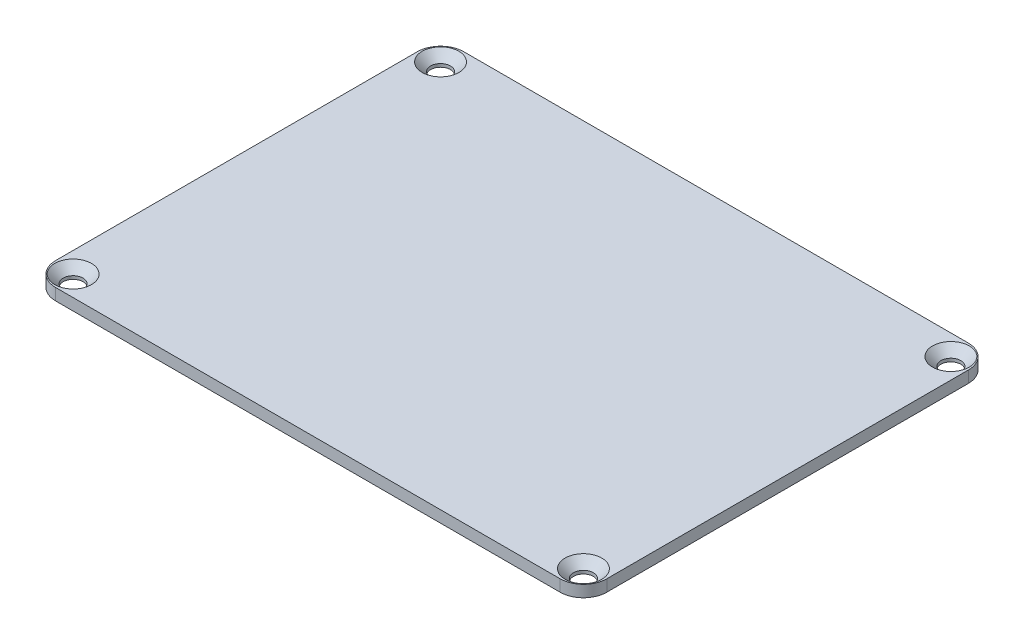
ISO-10303-21;
HEADER;
FILE_DESCRIPTION(('STEP AP214'),'2;1');
FILE_NAME('part.step','',(''),(''),'','','');
FILE_SCHEMA(('AUTOMOTIVE_DESIGN { 1 0 10303 214 1 1 1 1 }'));
ENDSEC;
DATA;
#1=APPLICATION_CONTEXT('core data for automotive mechanical design processes');
#2=APPLICATION_PROTOCOL_DEFINITION('international standard','automotive_design',2000,#1);
#3=PRODUCT_CONTEXT('',#1,'mechanical');
#4=PRODUCT('Part','Part','',(#3));
#5=PRODUCT_RELATED_PRODUCT_CATEGORY('part','',(#4));
#6=PRODUCT_DEFINITION_FORMATION('','',#4);
#7=PRODUCT_DEFINITION_CONTEXT('part definition',#1,'design');
#8=PRODUCT_DEFINITION('design','',#6,#7);
#9=PRODUCT_DEFINITION_SHAPE('','',#8);
#10=(LENGTH_UNIT() NAMED_UNIT(*) SI_UNIT(.MILLI.,.METRE.));
#11=(NAMED_UNIT(*) PLANE_ANGLE_UNIT() SI_UNIT($,.RADIAN.));
#12=(NAMED_UNIT(*) SI_UNIT($,.STERADIAN.) SOLID_ANGLE_UNIT());
#13=UNCERTAINTY_MEASURE_WITH_UNIT(LENGTH_MEASURE(1.E-05),#10,'distance_accuracy_value','');
#14=(GEOMETRIC_REPRESENTATION_CONTEXT(3) GLOBAL_UNCERTAINTY_ASSIGNED_CONTEXT((#13)) GLOBAL_UNIT_ASSIGNED_CONTEXT((#10,
#11,#12)) REPRESENTATION_CONTEXT('',''));
#15=CARTESIAN_POINT('',(0.,0.,0.));
#16=DIRECTION('',(0.,0.,1.));
#17=DIRECTION('',(1.,0.,0.));
#18=AXIS2_PLACEMENT_3D('',#15,#16,#17);
#19=CARTESIAN_POINT('',(47.25,-2.,-35.));
#20=DIRECTION('',(1.,0.,0.));
#21=DIRECTION('',(0.,0.,-1.));
#22=AXIS2_PLACEMENT_3D('',#19,#20,#21);
#23=PLANE('',#22);
#24=DIRECTION('',(0.,0.,-1.));
#25=VECTOR('',#24,1.);
#26=CARTESIAN_POINT('',(47.25,-2.,-35.));
#27=LINE('',#26,#25);
#28=CARTESIAN_POINT('',(47.25,-2.,31.));
#29=VERTEX_POINT('',#28);
#30=CARTESIAN_POINT('',(47.25,-2.,-31.));
#31=VERTEX_POINT('',#30);
#32=EDGE_CURVE('E179',#29,#31,#27,.T.);
#33=ORIENTED_EDGE('',*,*,#32,.T.);
#34=DIRECTION('',(0.,1.,0.));
#35=VECTOR('',#34,1.);
#36=CARTESIAN_POINT('',(47.25,-2.,-31.));
#37=LINE('',#36,#35);
#38=CARTESIAN_POINT('',(47.25,0.,-31.));
#39=VERTEX_POINT('',#38);
#40=EDGE_CURVE('E173',#31,#39,#37,.T.);
#41=ORIENTED_EDGE('',*,*,#40,.T.);
#42=DIRECTION('',(0.,0.,-1.));
#43=VECTOR('',#42,1.);
#44=CARTESIAN_POINT('',(47.25,0.,-35.));
#45=LINE('',#44,#43);
#46=CARTESIAN_POINT('',(47.25,0.,31.));
#47=VERTEX_POINT('',#46);
#48=EDGE_CURVE('E111',#47,#39,#45,.T.);
#49=ORIENTED_EDGE('',*,*,#48,.F.);
#50=DIRECTION('',(0.,1.,0.));
#51=VECTOR('',#50,1.);
#52=CARTESIAN_POINT('',(47.25,-2.,31.));
#53=LINE('',#52,#51);
#54=EDGE_CURVE('E170',#47,#29,#53,.F.);
#55=ORIENTED_EDGE('',*,*,#54,.T.);
#56=EDGE_LOOP('',(#33,#41,#49,#55));
#57=FACE_BOUND('',#56,.T.);
#58=ADVANCED_FACE('F39',(#57),#23,.T.);
#59=CARTESIAN_POINT('',(-47.25,-2.,35.));
#60=DIRECTION('',(0.,0.,1.));
#61=DIRECTION('',(1.,0.,0.));
#62=AXIS2_PLACEMENT_3D('',#59,#60,#61);
#63=PLANE('',#62);
#64=DIRECTION('',(1.,0.,0.));
#65=VECTOR('',#64,1.);
#66=CARTESIAN_POINT('',(-47.25,-2.,35.));
#67=LINE('',#66,#65);
#68=CARTESIAN_POINT('',(-43.25,-2.,35.));
#69=VERTEX_POINT('',#68);
#70=CARTESIAN_POINT('',(43.25,-2.,35.));
#71=VERTEX_POINT('',#70);
#72=EDGE_CURVE('E135',#69,#71,#67,.T.);
#73=ORIENTED_EDGE('',*,*,#72,.T.);
#74=DIRECTION('',(0.,1.,0.));
#75=VECTOR('',#74,1.);
#76=CARTESIAN_POINT('',(43.25,-2.,35.));
#77=LINE('',#76,#75);
#78=CARTESIAN_POINT('',(43.25,0.,35.));
#79=VERTEX_POINT('',#78);
#80=EDGE_CURVE('E11',#71,#79,#77,.T.);
#81=ORIENTED_EDGE('',*,*,#80,.T.);
#82=DIRECTION('',(1.,0.,0.));
#83=VECTOR('',#82,1.);
#84=CARTESIAN_POINT('',(-47.25,0.,35.));
#85=LINE('',#84,#83);
#86=CARTESIAN_POINT('',(-43.25,0.,35.));
#87=VERTEX_POINT('',#86);
#88=EDGE_CURVE('E182',#87,#79,#85,.T.);
#89=ORIENTED_EDGE('',*,*,#88,.F.);
#90=DIRECTION('',(0.,1.,0.));
#91=VECTOR('',#90,1.);
#92=CARTESIAN_POINT('',(-43.25,-2.,35.));
#93=LINE('',#92,#91);
#94=EDGE_CURVE('E48',#87,#69,#93,.F.);
#95=ORIENTED_EDGE('',*,*,#94,.T.);
#96=EDGE_LOOP('',(#73,#81,#89,#95));
#97=FACE_BOUND('',#96,.T.);
#98=ADVANCED_FACE('F257',(#97),#63,.T.);
#99=CARTESIAN_POINT('',(-47.25,-2.,-35.));
#100=DIRECTION('',(-1.,0.,0.));
#101=DIRECTION('',(0.,0.,1.));
#102=AXIS2_PLACEMENT_3D('',#99,#100,#101);
#103=PLANE('',#102);
#104=DIRECTION('',(0.,0.,1.));
#105=VECTOR('',#104,1.);
#106=CARTESIAN_POINT('',(-47.25,0.,-35.));
#107=LINE('',#106,#105);
#108=CARTESIAN_POINT('',(-47.25,0.,-31.));
#109=VERTEX_POINT('',#108);
#110=CARTESIAN_POINT('',(-47.25,0.,31.));
#111=VERTEX_POINT('',#110);
#112=EDGE_CURVE('E129',#109,#111,#107,.T.);
#113=ORIENTED_EDGE('',*,*,#112,.F.);
#114=DIRECTION('',(0.,1.,0.));
#115=VECTOR('',#114,1.);
#116=CARTESIAN_POINT('',(-47.25,-2.,-31.));
#117=LINE('',#116,#115);
#118=CARTESIAN_POINT('',(-47.25,-2.,-31.));
#119=VERTEX_POINT('',#118);
#120=EDGE_CURVE('E157',#109,#119,#117,.F.);
#121=ORIENTED_EDGE('',*,*,#120,.T.);
#122=DIRECTION('',(0.,0.,1.));
#123=VECTOR('',#122,1.);
#124=CARTESIAN_POINT('',(-47.25,-2.,-35.));
#125=LINE('',#124,#123);
#126=CARTESIAN_POINT('',(-47.25,-2.,31.));
#127=VERTEX_POINT('',#126);
#128=EDGE_CURVE('E141',#119,#127,#125,.T.);
#129=ORIENTED_EDGE('',*,*,#128,.T.);
#130=DIRECTION('',(0.,1.,0.));
#131=VECTOR('',#130,1.);
#132=CARTESIAN_POINT('',(-47.25,-2.,31.));
#133=LINE('',#132,#131);
#134=EDGE_CURVE('E153',#127,#111,#133,.T.);
#135=ORIENTED_EDGE('',*,*,#134,.T.);
#136=EDGE_LOOP('',(#113,#121,#129,#135));
#137=FACE_BOUND('',#136,.T.);
#138=ADVANCED_FACE('F262',(#137),#103,.T.);
#139=CARTESIAN_POINT('',(-47.25,-2.,-35.));
#140=DIRECTION('',(0.,0.,-1.));
#141=DIRECTION('',(-1.,0.,0.));
#142=AXIS2_PLACEMENT_3D('',#139,#140,#141);
#143=PLANE('',#142);
#144=DIRECTION('',(-1.,0.,0.));
#145=VECTOR('',#144,1.);
#146=CARTESIAN_POINT('',(-47.25,-2.,-35.));
#147=LINE('',#146,#145);
#148=CARTESIAN_POINT('',(43.25,-2.,-35.));
#149=VERTEX_POINT('',#148);
#150=CARTESIAN_POINT('',(-43.25,-2.,-35.));
#151=VERTEX_POINT('',#150);
#152=EDGE_CURVE('E181',#149,#151,#147,.T.);
#153=ORIENTED_EDGE('',*,*,#152,.T.);
#154=DIRECTION('',(0.,1.,0.));
#155=VECTOR('',#154,1.);
#156=CARTESIAN_POINT('',(-43.25,-2.,-35.));
#157=LINE('',#156,#155);
#158=CARTESIAN_POINT('',(-43.25,0.,-35.));
#159=VERTEX_POINT('',#158);
#160=EDGE_CURVE('E127',#151,#159,#157,.T.);
#161=ORIENTED_EDGE('',*,*,#160,.T.);
#162=DIRECTION('',(-1.,0.,0.));
#163=VECTOR('',#162,1.);
#164=CARTESIAN_POINT('',(-47.25,0.,-35.));
#165=LINE('',#164,#163);
#166=CARTESIAN_POINT('',(43.25,0.,-35.));
#167=VERTEX_POINT('',#166);
#168=EDGE_CURVE('E109',#167,#159,#165,.T.);
#169=ORIENTED_EDGE('',*,*,#168,.F.);
#170=DIRECTION('',(0.,1.,0.));
#171=VECTOR('',#170,1.);
#172=CARTESIAN_POINT('',(43.25,-2.,-35.));
#173=LINE('',#172,#171);
#174=EDGE_CURVE('E124',#167,#149,#173,.F.);
#175=ORIENTED_EDGE('',*,*,#174,.T.);
#176=EDGE_LOOP('',(#153,#161,#169,#175));
#177=FACE_BOUND('',#176,.T.);
#178=ADVANCED_FACE('F123',(#177),#143,.T.);
#179=CARTESIAN_POINT('',(0.,-2.,0.));
#180=DIRECTION('',(0.,1.,0.));
#181=DIRECTION('',(0.,0.,1.));
#182=AXIS2_PLACEMENT_3D('',#179,#180,#181);
#183=PLANE('',#182);
#184=CARTESIAN_POINT('',(-43.75,-2.,-31.5));
#185=DIRECTION('',(0.,1.,0.));
#186=DIRECTION('',(0.,0.,1.));
#187=AXIS2_PLACEMENT_3D('',#184,#185,#186);
#188=CIRCLE('',#187,1.69999999999999);
#189=CARTESIAN_POINT('',(-43.75,-2.,-29.8));
#190=VERTEX_POINT('',#189);
#191=EDGE_CURVE('E144',#190,#190,#188,.T.);
#192=ORIENTED_EDGE('',*,*,#191,.T.);
#193=EDGE_LOOP('',(#192));
#194=FACE_BOUND('',#193,.T.);
#195=CARTESIAN_POINT('',(43.75,-2.,-31.5));
#196=DIRECTION('',(0.,1.,0.));
#197=DIRECTION('',(0.,0.,1.));
#198=AXIS2_PLACEMENT_3D('',#195,#196,#197);
#199=CIRCLE('',#198,1.69999999999999);
#200=CARTESIAN_POINT('',(43.75,-2.,-29.8));
#201=VERTEX_POINT('',#200);
#202=EDGE_CURVE('E210',#201,#201,#199,.T.);
#203=ORIENTED_EDGE('',*,*,#202,.T.);
#204=EDGE_LOOP('',(#203));
#205=FACE_BOUND('',#204,.T.);
#206=CARTESIAN_POINT('',(43.75,-2.,31.5));
#207=DIRECTION('',(0.,1.,0.));
#208=DIRECTION('',(0.,0.,1.));
#209=AXIS2_PLACEMENT_3D('',#206,#207,#208);
#210=CIRCLE('',#209,1.69999999999999);
#211=CARTESIAN_POINT('',(43.75,-2.,33.2));
#212=VERTEX_POINT('',#211);
#213=EDGE_CURVE('E205',#212,#212,#210,.T.);
#214=ORIENTED_EDGE('',*,*,#213,.T.);
#215=EDGE_LOOP('',(#214));
#216=FACE_BOUND('',#215,.T.);
#217=CARTESIAN_POINT('',(-43.75,-2.,31.5));
#218=DIRECTION('',(0.,1.,0.));
#219=DIRECTION('',(0.,0.,1.));
#220=AXIS2_PLACEMENT_3D('',#217,#218,#219);
#221=CIRCLE('',#220,1.69999999999999);
#222=CARTESIAN_POINT('',(-43.75,-2.,33.2));
#223=VERTEX_POINT('',#222);
#224=EDGE_CURVE('E197',#223,#223,#221,.T.);
#225=ORIENTED_EDGE('',*,*,#224,.T.);
#226=EDGE_LOOP('',(#225));
#227=FACE_BOUND('',#226,.T.);
#228=ORIENTED_EDGE('',*,*,#128,.F.);
#229=CARTESIAN_POINT('',(-43.25,-2.,-31.));
#230=DIRECTION('',(0.,1.,0.));
#231=DIRECTION('',(0.,0.,1.));
#232=AXIS2_PLACEMENT_3D('',#229,#230,#231);
#233=CIRCLE('',#232,4.);
#234=EDGE_CURVE('E167',#119,#151,#233,.F.);
#235=ORIENTED_EDGE('',*,*,#234,.T.);
#236=ORIENTED_EDGE('',*,*,#152,.F.);
#237=CARTESIAN_POINT('',(43.25,-2.,-31.));
#238=DIRECTION('',(0.,1.,0.));
#239=DIRECTION('',(0.,0.,1.));
#240=AXIS2_PLACEMENT_3D('',#237,#238,#239);
#241=CIRCLE('',#240,4.);
#242=EDGE_CURVE('E133',#149,#31,#241,.F.);
#243=ORIENTED_EDGE('',*,*,#242,.T.);
#244=ORIENTED_EDGE('',*,*,#32,.F.);
#245=CARTESIAN_POINT('',(43.25,-2.,31.));
#246=DIRECTION('',(0.,1.,0.));
#247=DIRECTION('',(0.,0.,1.));
#248=AXIS2_PLACEMENT_3D('',#245,#246,#247);
#249=CIRCLE('',#248,4.);
#250=EDGE_CURVE('E55',#29,#71,#249,.F.);
#251=ORIENTED_EDGE('',*,*,#250,.T.);
#252=ORIENTED_EDGE('',*,*,#72,.F.);
#253=CARTESIAN_POINT('',(-43.25,-2.,31.));
#254=DIRECTION('',(0.,1.,0.));
#255=DIRECTION('',(0.,0.,1.));
#256=AXIS2_PLACEMENT_3D('',#253,#254,#255);
#257=CIRCLE('',#256,4.);
#258=EDGE_CURVE('E160',#69,#127,#257,.F.);
#259=ORIENTED_EDGE('',*,*,#258,.T.);
#260=EDGE_LOOP('',(#228,#235,#236,#243,#244,#251,#252,#259));
#261=FACE_BOUND('',#260,.T.);
#262=ADVANCED_FACE('F288',(#194,#205,#216,#227,#261),#183,.F.);
#263=CARTESIAN_POINT('',(0.,0.,0.));
#264=DIRECTION('',(0.,1.,0.));
#265=DIRECTION('',(0.,0.,1.));
#266=AXIS2_PLACEMENT_3D('',#263,#264,#265);
#267=PLANE('',#266);
#268=CARTESIAN_POINT('',(-43.75,0.,-31.5));
#269=DIRECTION('',(0.,1.,0.));
#270=DIRECTION('',(0.,0.,1.));
#271=AXIS2_PLACEMENT_3D('',#268,#269,#270);
#272=CIRCLE('',#271,3.15);
#273=CARTESIAN_POINT('',(-43.75,0.,-28.35));
#274=VERTEX_POINT('',#273);
#275=EDGE_CURVE('E428',#274,#274,#272,.T.);
#276=ORIENTED_EDGE('',*,*,#275,.F.);
#277=EDGE_LOOP('',(#276));
#278=FACE_BOUND('',#277,.T.);
#279=CARTESIAN_POINT('',(43.75,0.,-31.5));
#280=DIRECTION('',(0.,1.,0.));
#281=DIRECTION('',(0.,0.,1.));
#282=AXIS2_PLACEMENT_3D('',#279,#280,#281);
#283=CIRCLE('',#282,3.15);
#284=CARTESIAN_POINT('',(43.75,0.,-28.35));
#285=VERTEX_POINT('',#284);
#286=EDGE_CURVE('E222',#285,#285,#283,.T.);
#287=ORIENTED_EDGE('',*,*,#286,.F.);
#288=EDGE_LOOP('',(#287));
#289=FACE_BOUND('',#288,.T.);
#290=CARTESIAN_POINT('',(43.75,0.,31.5));
#291=DIRECTION('',(0.,1.,0.));
#292=DIRECTION('',(0.,0.,1.));
#293=AXIS2_PLACEMENT_3D('',#290,#291,#292);
#294=CIRCLE('',#293,3.15);
#295=CARTESIAN_POINT('',(43.75,0.,34.65));
#296=VERTEX_POINT('',#295);
#297=EDGE_CURVE('E213',#296,#296,#294,.T.);
#298=ORIENTED_EDGE('',*,*,#297,.F.);
#299=EDGE_LOOP('',(#298));
#300=FACE_BOUND('',#299,.T.);
#301=CARTESIAN_POINT('',(-43.75,0.,31.5));
#302=DIRECTION('',(0.,1.,0.));
#303=DIRECTION('',(0.,0.,1.));
#304=AXIS2_PLACEMENT_3D('',#301,#302,#303);
#305=CIRCLE('',#304,3.15);
#306=CARTESIAN_POINT('',(-43.75,0.,34.65));
#307=VERTEX_POINT('',#306);
#308=EDGE_CURVE('E208',#307,#307,#305,.T.);
#309=ORIENTED_EDGE('',*,*,#308,.F.);
#310=EDGE_LOOP('',(#309));
#311=FACE_BOUND('',#310,.T.);
#312=ORIENTED_EDGE('',*,*,#168,.T.);
#313=CARTESIAN_POINT('',(-43.25,0.,-31.));
#314=DIRECTION('',(0.,1.,0.));
#315=DIRECTION('',(0.,0.,1.));
#316=AXIS2_PLACEMENT_3D('',#313,#314,#315);
#317=CIRCLE('',#316,4.);
#318=EDGE_CURVE('E117',#159,#109,#317,.T.);
#319=ORIENTED_EDGE('',*,*,#318,.T.);
#320=ORIENTED_EDGE('',*,*,#112,.T.);
#321=CARTESIAN_POINT('',(-43.25,0.,31.));
#322=DIRECTION('',(0.,1.,0.));
#323=DIRECTION('',(0.,0.,1.));
#324=AXIS2_PLACEMENT_3D('',#321,#322,#323);
#325=CIRCLE('',#324,4.);
#326=EDGE_CURVE('E139',#111,#87,#325,.T.);
#327=ORIENTED_EDGE('',*,*,#326,.T.);
#328=ORIENTED_EDGE('',*,*,#88,.T.);
#329=CARTESIAN_POINT('',(43.25,0.,31.));
#330=DIRECTION('',(0.,1.,0.));
#331=DIRECTION('',(0.,0.,1.));
#332=AXIS2_PLACEMENT_3D('',#329,#330,#331);
#333=CIRCLE('',#332,4.);
#334=EDGE_CURVE('E118',#79,#47,#333,.T.);
#335=ORIENTED_EDGE('',*,*,#334,.T.);
#336=ORIENTED_EDGE('',*,*,#48,.T.);
#337=CARTESIAN_POINT('',(43.25,0.,-31.));
#338=DIRECTION('',(0.,1.,0.));
#339=DIRECTION('',(0.,0.,1.));
#340=AXIS2_PLACEMENT_3D('',#337,#338,#339);
#341=CIRCLE('',#340,4.);
#342=EDGE_CURVE('E106',#39,#167,#341,.T.);
#343=ORIENTED_EDGE('',*,*,#342,.T.);
#344=EDGE_LOOP('',(#312,#319,#320,#327,#328,#335,#336,#343));
#345=FACE_BOUND('',#344,.T.);
#346=ADVANCED_FACE('F108',(#278,#289,#300,#311,#345),#267,.T.);
#347=CARTESIAN_POINT('',(-43.75,0.,31.5));
#348=DIRECTION('',(0.,1.,0.));
#349=DIRECTION('',(0.,0.,1.));
#350=AXIS2_PLACEMENT_3D('',#347,#348,#349);
#351=CYLINDRICAL_SURFACE('',#350,1.69999999999999);
#352=CARTESIAN_POINT('',(-43.75,-1.45,31.5));
#353=DIRECTION('',(0.,1.,0.));
#354=DIRECTION('',(0.,0.,1.));
#355=AXIS2_PLACEMENT_3D('',#352,#353,#354);
#356=CIRCLE('',#355,1.69999999999999);
#357=CARTESIAN_POINT('',(-43.75,-1.45,33.2));
#358=VERTEX_POINT('',#357);
#359=EDGE_CURVE('E190',#358,#358,#356,.T.);
#360=ORIENTED_EDGE('',*,*,#359,.T.);
#361=EDGE_LOOP('',(#360));
#362=FACE_BOUND('',#361,.T.);
#363=ORIENTED_EDGE('',*,*,#224,.F.);
#364=EDGE_LOOP('',(#363));
#365=FACE_BOUND('',#364,.T.);
#366=ADVANCED_FACE('F241',(#362,#365),#351,.F.);
#367=CARTESIAN_POINT('',(-43.75,0.,31.5));
#368=DIRECTION('',(0.,1.,0.));
#369=DIRECTION('',(0.,0.,1.));
#370=AXIS2_PLACEMENT_3D('',#367,#368,#369);
#371=CONICAL_SURFACE('',#370,3.15,0.785398163397451);
#372=ORIENTED_EDGE('',*,*,#359,.F.);
#373=EDGE_LOOP('',(#372));
#374=FACE_BOUND('',#373,.T.);
#375=ORIENTED_EDGE('',*,*,#308,.T.);
#376=EDGE_LOOP('',(#375));
#377=FACE_BOUND('',#376,.T.);
#378=ADVANCED_FACE('F244',(#374,#377),#371,.F.);
#379=CARTESIAN_POINT('',(43.75,0.,31.5));
#380=DIRECTION('',(0.,1.,0.));
#381=DIRECTION('',(0.,0.,1.));
#382=AXIS2_PLACEMENT_3D('',#379,#380,#381);
#383=CYLINDRICAL_SURFACE('',#382,1.69999999999999);
#384=CARTESIAN_POINT('',(43.75,-1.45,31.5));
#385=DIRECTION('',(0.,1.,0.));
#386=DIRECTION('',(0.,0.,1.));
#387=AXIS2_PLACEMENT_3D('',#384,#385,#386);
#388=CIRCLE('',#387,1.69999999999999);
#389=CARTESIAN_POINT('',(43.75,-1.45,33.2));
#390=VERTEX_POINT('',#389);
#391=EDGE_CURVE('E209',#390,#390,#388,.T.);
#392=ORIENTED_EDGE('',*,*,#391,.T.);
#393=EDGE_LOOP('',(#392));
#394=FACE_BOUND('',#393,.T.);
#395=ORIENTED_EDGE('',*,*,#213,.F.);
#396=EDGE_LOOP('',(#395));
#397=FACE_BOUND('',#396,.T.);
#398=ADVANCED_FACE('F246',(#394,#397),#383,.F.);
#399=CARTESIAN_POINT('',(43.75,0.,31.5));
#400=DIRECTION('',(0.,1.,0.));
#401=DIRECTION('',(0.,0.,1.));
#402=AXIS2_PLACEMENT_3D('',#399,#400,#401);
#403=CONICAL_SURFACE('',#402,3.15,0.785398163397451);
#404=ORIENTED_EDGE('',*,*,#391,.F.);
#405=EDGE_LOOP('',(#404));
#406=FACE_BOUND('',#405,.T.);
#407=ORIENTED_EDGE('',*,*,#297,.T.);
#408=EDGE_LOOP('',(#407));
#409=FACE_BOUND('',#408,.T.);
#410=ADVANCED_FACE('F252',(#406,#409),#403,.F.);
#411=CARTESIAN_POINT('',(43.75,0.,-31.5));
#412=DIRECTION('',(0.,1.,0.));
#413=DIRECTION('',(0.,0.,1.));
#414=AXIS2_PLACEMENT_3D('',#411,#412,#413);
#415=CYLINDRICAL_SURFACE('',#414,1.69999999999999);
#416=CARTESIAN_POINT('',(43.75,-1.45,-31.5));
#417=DIRECTION('',(0.,1.,0.));
#418=DIRECTION('',(0.,0.,1.));
#419=AXIS2_PLACEMENT_3D('',#416,#417,#418);
#420=CIRCLE('',#419,1.69999999999999);
#421=CARTESIAN_POINT('',(43.75,-1.45,-29.8));
#422=VERTEX_POINT('',#421);
#423=EDGE_CURVE('E214',#422,#422,#420,.T.);
#424=ORIENTED_EDGE('',*,*,#423,.T.);
#425=EDGE_LOOP('',(#424));
#426=FACE_BOUND('',#425,.T.);
#427=ORIENTED_EDGE('',*,*,#202,.F.);
#428=EDGE_LOOP('',(#427));
#429=FACE_BOUND('',#428,.T.);
#430=ADVANCED_FACE('F365',(#426,#429),#415,.F.);
#431=CARTESIAN_POINT('',(43.75,0.,-31.5));
#432=DIRECTION('',(0.,1.,0.));
#433=DIRECTION('',(0.,0.,1.));
#434=AXIS2_PLACEMENT_3D('',#431,#432,#433);
#435=CONICAL_SURFACE('',#434,3.15,0.785398163397451);
#436=ORIENTED_EDGE('',*,*,#423,.F.);
#437=EDGE_LOOP('',(#436));
#438=FACE_BOUND('',#437,.T.);
#439=ORIENTED_EDGE('',*,*,#286,.T.);
#440=EDGE_LOOP('',(#439));
#441=FACE_BOUND('',#440,.T.);
#442=ADVANCED_FACE('F357',(#438,#441),#435,.F.);
#443=CARTESIAN_POINT('',(-43.75,0.,-31.5));
#444=DIRECTION('',(0.,1.,0.));
#445=DIRECTION('',(0.,0.,1.));
#446=AXIS2_PLACEMENT_3D('',#443,#444,#445);
#447=CYLINDRICAL_SURFACE('',#446,1.69999999999999);
#448=CARTESIAN_POINT('',(-43.75,-1.45,-31.5));
#449=DIRECTION('',(0.,1.,0.));
#450=DIRECTION('',(0.,0.,1.));
#451=AXIS2_PLACEMENT_3D('',#448,#449,#450);
#452=CIRCLE('',#451,1.69999999999999);
#453=CARTESIAN_POINT('',(-43.75,-1.45,-29.8));
#454=VERTEX_POINT('',#453);
#455=EDGE_CURVE('E424',#454,#454,#452,.T.);
#456=ORIENTED_EDGE('',*,*,#455,.T.);
#457=EDGE_LOOP('',(#456));
#458=FACE_BOUND('',#457,.T.);
#459=ORIENTED_EDGE('',*,*,#191,.F.);
#460=EDGE_LOOP('',(#459));
#461=FACE_BOUND('',#460,.T.);
#462=ADVANCED_FACE('F350',(#458,#461),#447,.F.);
#463=CARTESIAN_POINT('',(-43.75,0.,-31.5));
#464=DIRECTION('',(0.,1.,0.));
#465=DIRECTION('',(0.,0.,1.));
#466=AXIS2_PLACEMENT_3D('',#463,#464,#465);
#467=CONICAL_SURFACE('',#466,3.15,0.785398163397451);
#468=ORIENTED_EDGE('',*,*,#455,.F.);
#469=EDGE_LOOP('',(#468));
#470=FACE_BOUND('',#469,.T.);
#471=ORIENTED_EDGE('',*,*,#275,.T.);
#472=EDGE_LOOP('',(#471));
#473=FACE_BOUND('',#472,.T.);
#474=ADVANCED_FACE('F270',(#470,#473),#467,.F.);
#475=CARTESIAN_POINT('',(-43.25,-2.,-31.));
#476=DIRECTION('',(0.,1.,0.));
#477=DIRECTION('',(0.,0.,1.));
#478=AXIS2_PLACEMENT_3D('',#475,#476,#477);
#479=CYLINDRICAL_SURFACE('',#478,4.);
#480=ORIENTED_EDGE('',*,*,#234,.F.);
#481=ORIENTED_EDGE('',*,*,#120,.F.);
#482=ORIENTED_EDGE('',*,*,#318,.F.);
#483=ORIENTED_EDGE('',*,*,#160,.F.);
#484=EDGE_LOOP('',(#480,#481,#482,#483));
#485=FACE_BOUND('',#484,.T.);
#486=ADVANCED_FACE('F267',(#485),#479,.T.);
#487=CARTESIAN_POINT('',(43.25,-2.,-31.));
#488=DIRECTION('',(0.,1.,0.));
#489=DIRECTION('',(0.,0.,1.));
#490=AXIS2_PLACEMENT_3D('',#487,#488,#489);
#491=CYLINDRICAL_SURFACE('',#490,4.);
#492=ORIENTED_EDGE('',*,*,#242,.F.);
#493=ORIENTED_EDGE('',*,*,#174,.F.);
#494=ORIENTED_EDGE('',*,*,#342,.F.);
#495=ORIENTED_EDGE('',*,*,#40,.F.);
#496=EDGE_LOOP('',(#492,#493,#494,#495));
#497=FACE_BOUND('',#496,.T.);
#498=ADVANCED_FACE('F132',(#497),#491,.T.);
#499=CARTESIAN_POINT('',(43.25,-2.,31.));
#500=DIRECTION('',(0.,1.,0.));
#501=DIRECTION('',(0.,0.,1.));
#502=AXIS2_PLACEMENT_3D('',#499,#500,#501);
#503=CYLINDRICAL_SURFACE('',#502,4.);
#504=ORIENTED_EDGE('',*,*,#250,.F.);
#505=ORIENTED_EDGE('',*,*,#54,.F.);
#506=ORIENTED_EDGE('',*,*,#334,.F.);
#507=ORIENTED_EDGE('',*,*,#80,.F.);
#508=EDGE_LOOP('',(#504,#505,#506,#507));
#509=FACE_BOUND('',#508,.T.);
#510=ADVANCED_FACE('F273',(#509),#503,.T.);
#511=CARTESIAN_POINT('',(-43.25,-2.,31.));
#512=DIRECTION('',(0.,1.,0.));
#513=DIRECTION('',(0.,0.,1.));
#514=AXIS2_PLACEMENT_3D('',#511,#512,#513);
#515=CYLINDRICAL_SURFACE('',#514,4.);
#516=ORIENTED_EDGE('',*,*,#258,.F.);
#517=ORIENTED_EDGE('',*,*,#94,.F.);
#518=ORIENTED_EDGE('',*,*,#326,.F.);
#519=ORIENTED_EDGE('',*,*,#134,.F.);
#520=EDGE_LOOP('',(#516,#517,#518,#519));
#521=FACE_BOUND('',#520,.T.);
#522=ADVANCED_FACE('F41',(#521),#515,.T.);
#523=CLOSED_SHELL('',(#58,#98,#138,#178,#262,#346,#366,#378,#398,#410,#430,#442,#462,#474,#486,
#498,#510,#522));
#524=MANIFOLD_SOLID_BREP('B2',#523);
#525=ADVANCED_BREP_SHAPE_REPRESENTATION('',(#18,#524),#14);
#526=SHAPE_DEFINITION_REPRESENTATION(#9,#525);
ENDSEC;
END-ISO-10303-21;
